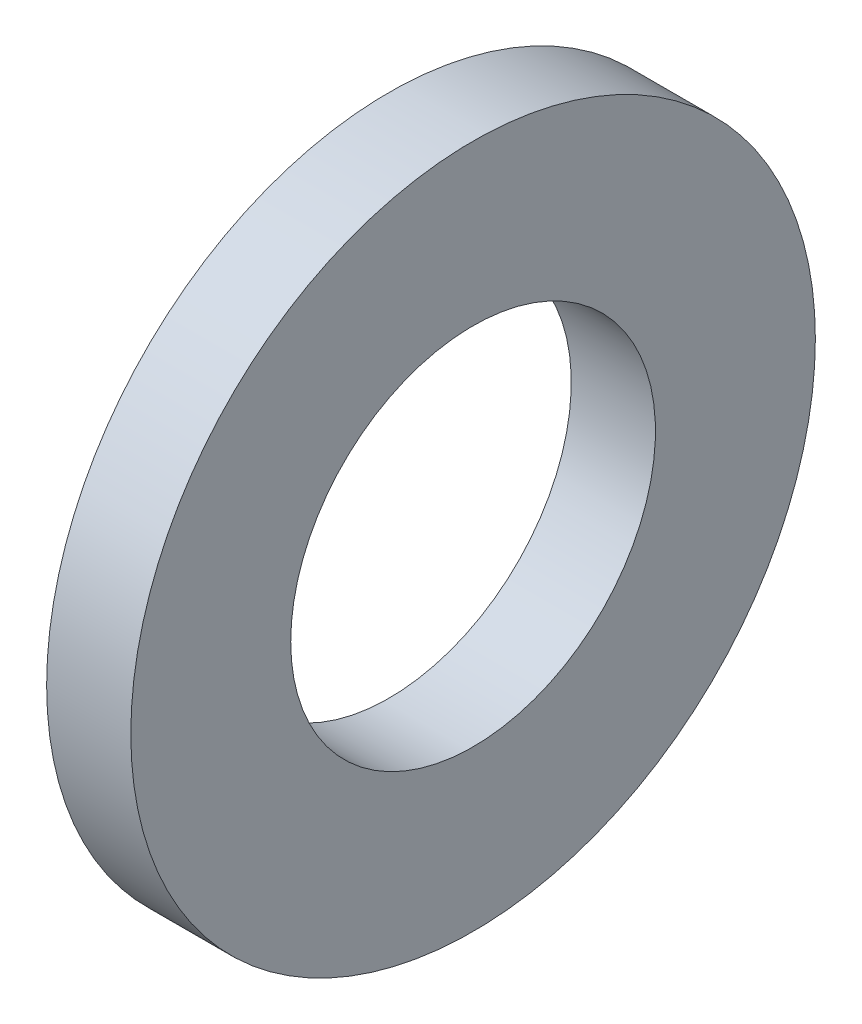
ISO-10303-21;
HEADER;
FILE_DESCRIPTION(('STEP AP214'),'2;1');
FILE_NAME('part.step','',(''),(''),'','','');
FILE_SCHEMA(('AUTOMOTIVE_DESIGN { 1 0 10303 214 1 1 1 1 }'));
ENDSEC;
DATA;
#1=APPLICATION_CONTEXT('core data for automotive mechanical design processes');
#2=APPLICATION_PROTOCOL_DEFINITION('international standard','automotive_design',2000,#1);
#3=PRODUCT_CONTEXT('',#1,'mechanical');
#4=PRODUCT('Part','Part','',(#3));
#5=PRODUCT_RELATED_PRODUCT_CATEGORY('part','',(#4));
#6=PRODUCT_DEFINITION_FORMATION('','',#4);
#7=PRODUCT_DEFINITION_CONTEXT('part definition',#1,'design');
#8=PRODUCT_DEFINITION('design','',#6,#7);
#9=PRODUCT_DEFINITION_SHAPE('','',#8);
#10=(LENGTH_UNIT() NAMED_UNIT(*) SI_UNIT(.MILLI.,.METRE.));
#11=(NAMED_UNIT(*) PLANE_ANGLE_UNIT() SI_UNIT($,.RADIAN.));
#12=(NAMED_UNIT(*) SI_UNIT($,.STERADIAN.) SOLID_ANGLE_UNIT());
#13=UNCERTAINTY_MEASURE_WITH_UNIT(LENGTH_MEASURE(1.E-05),#10,'distance_accuracy_value','');
#14=(GEOMETRIC_REPRESENTATION_CONTEXT(3) GLOBAL_UNCERTAINTY_ASSIGNED_CONTEXT((#13)) GLOBAL_UNIT_ASSIGNED_CONTEXT((#10,
#11,#12)) REPRESENTATION_CONTEXT('',''));
#15=CARTESIAN_POINT('',(0.,0.,0.));
#16=DIRECTION('',(0.,0.,1.));
#17=DIRECTION('',(1.,0.,0.));
#18=AXIS2_PLACEMENT_3D('',#15,#16,#17);
#19=CARTESIAN_POINT('',(0.,3.25,0.));
#20=DIRECTION('',(1.,0.,0.));
#21=DIRECTION('',(0.,0.,-1.));
#22=AXIS2_PLACEMENT_3D('',#19,#20,#21);
#23=PLANE('',#22);
#24=CARTESIAN_POINT('',(0.,0.,0.));
#25=DIRECTION('',(-1.,0.,0.));
#26=DIRECTION('',(0.,0.,1.));
#27=AXIS2_PLACEMENT_3D('',#24,#25,#26);
#28=CIRCLE('',#27,3.25);
#29=CARTESIAN_POINT('',(0.,0.,3.25));
#30=VERTEX_POINT('',#29);
#31=EDGE_CURVE('E46',#30,#30,#28,.T.);
#32=ORIENTED_EDGE('',*,*,#31,.F.);
#33=EDGE_LOOP('',(#32));
#34=FACE_BOUND('',#33,.T.);
#35=CARTESIAN_POINT('',(0.,0.,0.));
#36=DIRECTION('',(-1.,0.,0.));
#37=DIRECTION('',(0.,0.,1.));
#38=AXIS2_PLACEMENT_3D('',#35,#36,#37);
#39=CIRCLE('',#38,6.1);
#40=CARTESIAN_POINT('',(0.,0.,6.1));
#41=VERTEX_POINT('',#40);
#42=EDGE_CURVE('E10',#41,#41,#39,.T.);
#43=ORIENTED_EDGE('',*,*,#42,.T.);
#44=EDGE_LOOP('',(#43));
#45=FACE_BOUND('',#44,.T.);
#46=ADVANCED_FACE('F32',(#34,#45),#23,.F.);
#47=CARTESIAN_POINT('',(0.,0.,0.));
#48=DIRECTION('',(-1.,0.,0.));
#49=DIRECTION('',(0.,0.,1.));
#50=AXIS2_PLACEMENT_3D('',#47,#48,#49);
#51=CYLINDRICAL_SURFACE('',#50,6.1);
#52=ORIENTED_EDGE('',*,*,#42,.F.);
#53=EDGE_LOOP('',(#52));
#54=FACE_BOUND('',#53,.T.);
#55=CARTESIAN_POINT('',(1.5,0.,0.));
#56=DIRECTION('',(-1.,0.,0.));
#57=DIRECTION('',(0.,0.,1.));
#58=AXIS2_PLACEMENT_3D('',#55,#56,#57);
#59=CIRCLE('',#58,6.1);
#60=CARTESIAN_POINT('',(1.5,0.,6.1));
#61=VERTEX_POINT('',#60);
#62=EDGE_CURVE('E38',#61,#61,#59,.T.);
#63=ORIENTED_EDGE('',*,*,#62,.T.);
#64=EDGE_LOOP('',(#63));
#65=FACE_BOUND('',#64,.T.);
#66=ADVANCED_FACE('F55',(#54,#65),#51,.T.);
#67=CARTESIAN_POINT('',(1.5,3.25,0.));
#68=DIRECTION('',(-1.,0.,0.));
#69=DIRECTION('',(0.,0.,1.));
#70=AXIS2_PLACEMENT_3D('',#67,#68,#69);
#71=PLANE('',#70);
#72=ORIENTED_EDGE('',*,*,#62,.F.);
#73=EDGE_LOOP('',(#72));
#74=FACE_BOUND('',#73,.T.);
#75=CARTESIAN_POINT('',(1.5,0.,0.));
#76=DIRECTION('',(-1.,0.,0.));
#77=DIRECTION('',(0.,0.,1.));
#78=AXIS2_PLACEMENT_3D('',#75,#76,#77);
#79=CIRCLE('',#78,3.25);
#80=CARTESIAN_POINT('',(1.5,0.,3.25));
#81=VERTEX_POINT('',#80);
#82=EDGE_CURVE('E42',#81,#81,#79,.T.);
#83=ORIENTED_EDGE('',*,*,#82,.T.);
#84=EDGE_LOOP('',(#83));
#85=FACE_BOUND('',#84,.T.);
#86=ADVANCED_FACE('F59',(#74,#85),#71,.F.);
#87=CARTESIAN_POINT('',(0.,0.,0.));
#88=DIRECTION('',(-1.,0.,0.));
#89=DIRECTION('',(0.,0.,1.));
#90=AXIS2_PLACEMENT_3D('',#87,#88,#89);
#91=CYLINDRICAL_SURFACE('',#90,3.25);
#92=ORIENTED_EDGE('',*,*,#82,.F.);
#93=EDGE_LOOP('',(#92));
#94=FACE_BOUND('',#93,.T.);
#95=ORIENTED_EDGE('',*,*,#31,.T.);
#96=EDGE_LOOP('',(#95));
#97=FACE_BOUND('',#96,.T.);
#98=ADVANCED_FACE('F52',(#94,#97),#91,.F.);
#99=CLOSED_SHELL('',(#46,#66,#86,#98));
#100=MANIFOLD_SOLID_BREP('B2',#99);
#101=ADVANCED_BREP_SHAPE_REPRESENTATION('',(#18,#100),#14);
#102=SHAPE_DEFINITION_REPRESENTATION(#9,#101);
ENDSEC;
END-ISO-10303-21;
